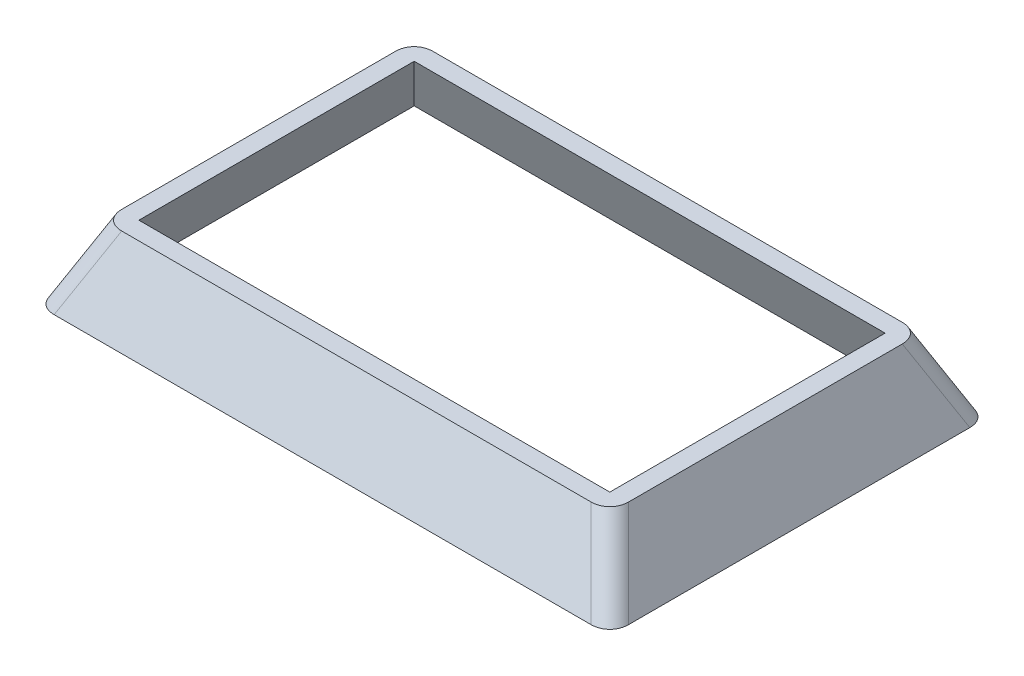
ISO-10303-21;
HEADER;
FILE_DESCRIPTION(('STEP AP214'),'2;1');
FILE_NAME('part.step','',(''),(''),'','','');
FILE_SCHEMA(('AUTOMOTIVE_DESIGN { 1 0 10303 214 1 1 1 1 }'));
ENDSEC;
DATA;
#1=APPLICATION_CONTEXT('core data for automotive mechanical design processes');
#2=APPLICATION_PROTOCOL_DEFINITION('international standard','automotive_design',2000,#1);
#3=PRODUCT_CONTEXT('',#1,'mechanical');
#4=PRODUCT('Part','Part','',(#3));
#5=PRODUCT_RELATED_PRODUCT_CATEGORY('part','',(#4));
#6=PRODUCT_DEFINITION_FORMATION('','',#4);
#7=PRODUCT_DEFINITION_CONTEXT('part definition',#1,'design');
#8=PRODUCT_DEFINITION('design','',#6,#7);
#9=PRODUCT_DEFINITION_SHAPE('','',#8);
#10=(LENGTH_UNIT() NAMED_UNIT(*) SI_UNIT(.MILLI.,.METRE.));
#11=(NAMED_UNIT(*) PLANE_ANGLE_UNIT() SI_UNIT($,.RADIAN.));
#12=(NAMED_UNIT(*) SI_UNIT($,.STERADIAN.) SOLID_ANGLE_UNIT());
#13=UNCERTAINTY_MEASURE_WITH_UNIT(LENGTH_MEASURE(1.E-05),#10,'distance_accuracy_value','');
#14=(GEOMETRIC_REPRESENTATION_CONTEXT(3) GLOBAL_UNCERTAINTY_ASSIGNED_CONTEXT((#13)) GLOBAL_UNIT_ASSIGNED_CONTEXT((#10,
#11,#12)) REPRESENTATION_CONTEXT('',''));
#15=CARTESIAN_POINT('',(0.,0.,0.));
#16=DIRECTION('',(0.,0.,1.));
#17=DIRECTION('',(1.,0.,0.));
#18=AXIS2_PLACEMENT_3D('',#15,#16,#17);
#19=CARTESIAN_POINT('',(0.,7.,0.));
#20=DIRECTION('',(0.,1.,0.));
#21=DIRECTION('',(0.,0.,1.));
#22=AXIS2_PLACEMENT_3D('',#19,#20,#21);
#23=PLANE('',#22);
#24=DIRECTION('',(0.,0.,1.));
#25=VECTOR('',#24,1.);
#26=CARTESIAN_POINT('',(-24.485846392915,7.,18.3));
#27=LINE('',#26,#25);
#28=CARTESIAN_POINT('',(-24.485846392915,7.,-13.2232308188417));
#29=VERTEX_POINT('',#28);
#30=CARTESIAN_POINT('',(-24.485846392915,7.,13.2232308188417));
#31=VERTEX_POINT('',#30);
#32=EDGE_CURVE('E194',#29,#31,#27,.T.);
#33=ORIENTED_EDGE('',*,*,#32,.T.);
#34=CARTESIAN_POINT('',(-22.27909055499,7.,12.82909055499));
#35=DIRECTION('',(0.,1.,0.));
#36=DIRECTION('',(-0.707106781186548,0.,0.707106781186547));
#37=AXIS2_PLACEMENT_3D('',#34,#35,#36);
#38=ELLIPSE('',#37,2.39573426248238,2.);
#39=CARTESIAN_POINT('',(-22.6732308188417,7.,15.035846392915));
#40=VERTEX_POINT('',#39);
#41=EDGE_CURVE('E250',#31,#40,#38,.T.);
#42=ORIENTED_EDGE('',*,*,#41,.T.);
#43=DIRECTION('',(1.,0.,0.));
#44=VECTOR('',#43,1.);
#45=CARTESIAN_POINT('',(27.75,7.,15.035846392915));
#46=LINE('',#45,#44);
#47=CARTESIAN_POINT('',(22.6732308188417,7.,15.035846392915));
#48=VERTEX_POINT('',#47);
#49=EDGE_CURVE('E204',#40,#48,#46,.T.);
#50=ORIENTED_EDGE('',*,*,#49,.T.);
#51=CARTESIAN_POINT('',(22.27909055499,7.,12.82909055499));
#52=DIRECTION('',(0.,1.,0.));
#53=DIRECTION('',(-0.707106781186547,0.,-0.707106781186548));
#54=AXIS2_PLACEMENT_3D('',#51,#52,#53);
#55=ELLIPSE('',#54,2.39573426248238,2.);
#56=CARTESIAN_POINT('',(24.485846392915,7.,13.2232308188417));
#57=VERTEX_POINT('',#56);
#58=EDGE_CURVE('E247',#48,#57,#55,.T.);
#59=ORIENTED_EDGE('',*,*,#58,.T.);
#60=DIRECTION('',(0.,0.,-1.));
#61=VECTOR('',#60,1.);
#62=CARTESIAN_POINT('',(24.485846392915,7.,-18.3));
#63=LINE('',#62,#61);
#64=CARTESIAN_POINT('',(24.485846392915,7.,-13.2232308188417));
#65=VERTEX_POINT('',#64);
#66=EDGE_CURVE('E201',#57,#65,#63,.T.);
#67=ORIENTED_EDGE('',*,*,#66,.T.);
#68=CARTESIAN_POINT('',(22.27909055499,7.,-12.82909055499));
#69=DIRECTION('',(0.,1.,0.));
#70=DIRECTION('',(-0.707106781186547,0.,0.707106781186548));
#71=AXIS2_PLACEMENT_3D('',#68,#69,#70);
#72=ELLIPSE('',#71,2.39573426248238,2.);
#73=CARTESIAN_POINT('',(22.6732308188417,7.,-15.035846392915));
#74=VERTEX_POINT('',#73);
#75=EDGE_CURVE('E67',#65,#74,#72,.T.);
#76=ORIENTED_EDGE('',*,*,#75,.T.);
#77=DIRECTION('',(-1.,0.,0.));
#78=VECTOR('',#77,1.);
#79=CARTESIAN_POINT('',(-27.75,7.,-15.035846392915));
#80=LINE('',#79,#78);
#81=CARTESIAN_POINT('',(-22.6732308188417,7.,-15.035846392915));
#82=VERTEX_POINT('',#81);
#83=EDGE_CURVE('E198',#74,#82,#80,.T.);
#84=ORIENTED_EDGE('',*,*,#83,.T.);
#85=CARTESIAN_POINT('',(-22.27909055499,7.,-12.82909055499));
#86=DIRECTION('',(0.,1.,0.));
#87=DIRECTION('',(-0.707106781186548,0.,-0.707106781186547));
#88=AXIS2_PLACEMENT_3D('',#85,#86,#87);
#89=ELLIPSE('',#88,2.39573426248238,2.);
#90=EDGE_CURVE('E242',#82,#29,#89,.T.);
#91=ORIENTED_EDGE('',*,*,#90,.T.);
#92=EDGE_LOOP('',(#33,#42,#50,#59,#67,#76,#84,#91));
#93=FACE_BOUND('',#92,.T.);
#94=DIRECTION('',(1.,0.,0.));
#95=VECTOR('',#94,1.);
#96=CARTESIAN_POINT('',(-22.75,7.,13.3));
#97=LINE('',#96,#95);
#98=CARTESIAN_POINT('',(-22.75,7.,13.3));
#99=VERTEX_POINT('',#98);
#100=CARTESIAN_POINT('',(22.75,7.,13.3));
#101=VERTEX_POINT('',#100);
#102=EDGE_CURVE('E139',#99,#101,#97,.T.);
#103=ORIENTED_EDGE('',*,*,#102,.F.);
#104=DIRECTION('',(0.,0.,1.));
#105=VECTOR('',#104,1.);
#106=CARTESIAN_POINT('',(-22.75,7.,-13.3));
#107=LINE('',#106,#105);
#108=CARTESIAN_POINT('',(-22.75,7.,-13.3));
#109=VERTEX_POINT('',#108);
#110=EDGE_CURVE('E150',#109,#99,#107,.T.);
#111=ORIENTED_EDGE('',*,*,#110,.F.);
#112=DIRECTION('',(-1.,0.,0.));
#113=VECTOR('',#112,1.);
#114=CARTESIAN_POINT('',(-22.75,7.,-13.3));
#115=LINE('',#114,#113);
#116=CARTESIAN_POINT('',(22.75,7.,-13.3));
#117=VERTEX_POINT('',#116);
#118=EDGE_CURVE('E163',#117,#109,#115,.T.);
#119=ORIENTED_EDGE('',*,*,#118,.F.);
#120=DIRECTION('',(0.,0.,-1.));
#121=VECTOR('',#120,1.);
#122=CARTESIAN_POINT('',(22.75,7.,-13.3));
#123=LINE('',#122,#121);
#124=EDGE_CURVE('E159',#101,#117,#123,.T.);
#125=ORIENTED_EDGE('',*,*,#124,.F.);
#126=EDGE_LOOP('',(#103,#111,#119,#125));
#127=FACE_BOUND('',#126,.T.);
#128=ADVANCED_FACE('F45',(#93,#127),#23,.T.);
#129=CARTESIAN_POINT('',(0.,0.,0.));
#130=DIRECTION('',(0.,1.,0.));
#131=DIRECTION('',(0.,0.,1.));
#132=AXIS2_PLACEMENT_3D('',#129,#130,#131);
#133=PLANE('',#132);
#134=DIRECTION('',(0.,0.,1.));
#135=VECTOR('',#134,1.);
#136=CARTESIAN_POINT('',(-26.014153607085,0.,13.3));
#137=LINE('',#136,#135);
#138=CARTESIAN_POINT('',(-26.014153607085,0.,-16.564153607085));
#139=VERTEX_POINT('',#138);
#140=CARTESIAN_POINT('',(-26.014153607085,0.,16.564153607085));
#141=VERTEX_POINT('',#140);
#142=EDGE_CURVE('E189',#139,#141,#137,.T.);
#143=ORIENTED_EDGE('',*,*,#142,.T.);
#144=DIRECTION('',(1.,0.,0.));
#145=VECTOR('',#144,1.);
#146=CARTESIAN_POINT('',(22.75,0.,16.564153607085));
#147=LINE('',#146,#145);
#148=CARTESIAN_POINT('',(26.014153607085,0.,16.564153607085));
#149=VERTEX_POINT('',#148);
#150=EDGE_CURVE('E142',#141,#149,#147,.T.);
#151=ORIENTED_EDGE('',*,*,#150,.T.);
#152=DIRECTION('',(0.,0.,-1.));
#153=VECTOR('',#152,1.);
#154=CARTESIAN_POINT('',(26.014153607085,0.,-13.3));
#155=LINE('',#154,#153);
#156=CARTESIAN_POINT('',(26.014153607085,0.,-16.564153607085));
#157=VERTEX_POINT('',#156);
#158=EDGE_CURVE('E183',#149,#157,#155,.T.);
#159=ORIENTED_EDGE('',*,*,#158,.T.);
#160=DIRECTION('',(-1.,0.,0.));
#161=VECTOR('',#160,1.);
#162=CARTESIAN_POINT('',(-22.75,0.,-16.564153607085));
#163=LINE('',#162,#161);
#164=EDGE_CURVE('E186',#157,#139,#163,.T.);
#165=ORIENTED_EDGE('',*,*,#164,.T.);
#166=EDGE_LOOP('',(#143,#151,#159,#165));
#167=FACE_BOUND('',#166,.T.);
#168=DIRECTION('',(1.,0.,0.));
#169=VECTOR('',#168,1.);
#170=CARTESIAN_POINT('',(-27.75,0.,18.3));
#171=LINE('',#170,#169);
#172=CARTESIAN_POINT('',(-25.9373844259267,0.,18.3));
#173=VERTEX_POINT('',#172);
#174=CARTESIAN_POINT('',(25.9373844259267,0.,18.3));
#175=VERTEX_POINT('',#174);
#176=EDGE_CURVE('E172',#173,#175,#171,.T.);
#177=ORIENTED_EDGE('',*,*,#176,.F.);
#178=CARTESIAN_POINT('',(-25.543244162075,0.,16.093244162075));
#179=DIRECTION('',(0.,1.,0.));
#180=DIRECTION('',(-0.707106781186548,0.,0.707106781186547));
#181=AXIS2_PLACEMENT_3D('',#178,#179,#180);
#182=ELLIPSE('',#181,2.39573426248238,2.);
#183=CARTESIAN_POINT('',(-27.75,0.,16.4873844259267));
#184=VERTEX_POINT('',#183);
#185=EDGE_CURVE('E232',#173,#184,#182,.F.);
#186=ORIENTED_EDGE('',*,*,#185,.T.);
#187=DIRECTION('',(0.,0.,1.));
#188=VECTOR('',#187,1.);
#189=CARTESIAN_POINT('',(-27.75,0.,-18.3));
#190=LINE('',#189,#188);
#191=CARTESIAN_POINT('',(-27.75,0.,-16.4873844259267));
#192=VERTEX_POINT('',#191);
#193=EDGE_CURVE('E168',#192,#184,#190,.T.);
#194=ORIENTED_EDGE('',*,*,#193,.F.);
#195=CARTESIAN_POINT('',(-25.543244162075,0.,-16.093244162075));
#196=DIRECTION('',(0.,1.,0.));
#197=DIRECTION('',(-0.707106781186548,0.,-0.707106781186547));
#198=AXIS2_PLACEMENT_3D('',#195,#196,#197);
#199=ELLIPSE('',#198,2.39573426248238,2.);
#200=CARTESIAN_POINT('',(-25.9373844259267,0.,-18.3));
#201=VERTEX_POINT('',#200);
#202=EDGE_CURVE('E223',#192,#201,#199,.F.);
#203=ORIENTED_EDGE('',*,*,#202,.T.);
#204=DIRECTION('',(-1.,0.,0.));
#205=VECTOR('',#204,1.);
#206=CARTESIAN_POINT('',(-27.75,0.,-18.3));
#207=LINE('',#206,#205);
#208=CARTESIAN_POINT('',(25.9373844259267,0.,-18.3));
#209=VERTEX_POINT('',#208);
#210=EDGE_CURVE('E180',#209,#201,#207,.T.);
#211=ORIENTED_EDGE('',*,*,#210,.F.);
#212=CARTESIAN_POINT('',(25.543244162075,0.,-16.093244162075));
#213=DIRECTION('',(0.,1.,0.));
#214=DIRECTION('',(-0.707106781186547,0.,0.707106781186548));
#215=AXIS2_PLACEMENT_3D('',#212,#213,#214);
#216=ELLIPSE('',#215,2.39573426248238,2.);
#217=CARTESIAN_POINT('',(27.75,0.,-16.4873844259267));
#218=VERTEX_POINT('',#217);
#219=EDGE_CURVE('E226',#209,#218,#216,.F.);
#220=ORIENTED_EDGE('',*,*,#219,.T.);
#221=DIRECTION('',(0.,0.,-1.));
#222=VECTOR('',#221,1.);
#223=CARTESIAN_POINT('',(27.75,0.,-18.3));
#224=LINE('',#223,#222);
#225=CARTESIAN_POINT('',(27.75,0.,16.4873844259267));
#226=VERTEX_POINT('',#225);
#227=EDGE_CURVE('E176',#226,#218,#224,.T.);
#228=ORIENTED_EDGE('',*,*,#227,.F.);
#229=CARTESIAN_POINT('',(25.543244162075,0.,16.093244162075));
#230=DIRECTION('',(0.,1.,0.));
#231=DIRECTION('',(-0.707106781186547,0.,-0.707106781186548));
#232=AXIS2_PLACEMENT_3D('',#229,#230,#231);
#233=ELLIPSE('',#232,2.39573426248238,2.);
#234=EDGE_CURVE('E229',#226,#175,#233,.F.);
#235=ORIENTED_EDGE('',*,*,#234,.T.);
#236=EDGE_LOOP('',(#177,#186,#194,#203,#211,#220,#228,#235));
#237=FACE_BOUND('',#236,.T.);
#238=ADVANCED_FACE('F270',(#167,#237),#133,.F.);
#239=CARTESIAN_POINT('',(0.,0.,-16.564153607085));
#240=DIRECTION('',(0.,-0.422618261740698,0.906307787036651));
#241=DIRECTION('',(1.,0.,0.));
#242=AXIS2_PLACEMENT_3D('',#239,#240,#241);
#243=PLANE('',#242);
#244=DIRECTION('',(0.389281620635024,-0.834817129478989,-0.389281620635024));
#245=VECTOR('',#244,1.);
#246=CARTESIAN_POINT('',(22.0719640826474,8.45405271711681,-12.6219640826474));
#247=LINE('',#246,#245);
#248=EDGE_CURVE('E146',#117,#157,#247,.T.);
#249=ORIENTED_EDGE('',*,*,#248,.F.);
#250=ORIENTED_EDGE('',*,*,#118,.T.);
#251=DIRECTION('',(-0.389281620635024,-0.834817129478989,-0.389281620635024));
#252=VECTOR('',#251,1.);
#253=CARTESIAN_POINT('',(-23.5040187851994,5.38300149694583,-14.0540187851993));
#254=LINE('',#253,#252);
#255=EDGE_CURVE('E153',#139,#109,#254,.F.);
#256=ORIENTED_EDGE('',*,*,#255,.F.);
#257=ORIENTED_EDGE('',*,*,#164,.F.);
#258=EDGE_LOOP('',(#249,#250,#256,#257));
#259=FACE_BOUND('',#258,.T.);
#260=ADVANCED_FACE('F305',(#259),#243,.T.);
#261=CARTESIAN_POINT('',(-26.014153607085,0.,0.));
#262=DIRECTION('',(0.906307787036651,-0.422618261740698,0.));
#263=DIRECTION('',(0.,0.,-1.));
#264=AXIS2_PLACEMENT_3D('',#261,#262,#263);
#265=PLANE('',#264);
#266=ORIENTED_EDGE('',*,*,#255,.T.);
#267=ORIENTED_EDGE('',*,*,#110,.T.);
#268=DIRECTION('',(-0.389281620635024,-0.834817129478989,0.389281620635024));
#269=VECTOR('',#268,1.);
#270=CARTESIAN_POINT('',(-22.0719640826474,8.45405271711682,12.6219640826474));
#271=LINE('',#270,#269);
#272=EDGE_CURVE('E135',#141,#99,#271,.F.);
#273=ORIENTED_EDGE('',*,*,#272,.F.);
#274=ORIENTED_EDGE('',*,*,#142,.F.);
#275=EDGE_LOOP('',(#266,#267,#273,#274));
#276=FACE_BOUND('',#275,.T.);
#277=ADVANCED_FACE('F151',(#276),#265,.T.);
#278=CARTESIAN_POINT('',(26.014153607085,0.,0.));
#279=DIRECTION('',(-0.906307787036651,-0.422618261740698,0.));
#280=DIRECTION('',(0.,0.,1.));
#281=AXIS2_PLACEMENT_3D('',#278,#279,#280);
#282=PLANE('',#281);
#283=ORIENTED_EDGE('',*,*,#248,.T.);
#284=ORIENTED_EDGE('',*,*,#158,.F.);
#285=DIRECTION('',(-0.389281620635024,0.834817129478989,-0.389281620635024));
#286=VECTOR('',#285,1.);
#287=CARTESIAN_POINT('',(22.0719640826474,8.45405271711681,12.6219640826474));
#288=LINE('',#287,#286);
#289=EDGE_CURVE('E147',#101,#149,#288,.F.);
#290=ORIENTED_EDGE('',*,*,#289,.F.);
#291=ORIENTED_EDGE('',*,*,#124,.T.);
#292=EDGE_LOOP('',(#283,#284,#290,#291));
#293=FACE_BOUND('',#292,.T.);
#294=ADVANCED_FACE('F316',(#293),#282,.T.);
#295=CARTESIAN_POINT('',(0.,0.,16.564153607085));
#296=DIRECTION('',(0.,-0.422618261740698,-0.906307787036651));
#297=DIRECTION('',(-1.,0.,0.));
#298=AXIS2_PLACEMENT_3D('',#295,#296,#297);
#299=PLANE('',#298);
#300=ORIENTED_EDGE('',*,*,#272,.T.);
#301=ORIENTED_EDGE('',*,*,#102,.T.);
#302=ORIENTED_EDGE('',*,*,#289,.T.);
#303=ORIENTED_EDGE('',*,*,#150,.F.);
#304=EDGE_LOOP('',(#300,#301,#302,#303));
#305=FACE_BOUND('',#304,.T.);
#306=ADVANCED_FACE('F137',(#305),#299,.T.);
#307=CARTESIAN_POINT('',(0.,7.,-15.035846392915));
#308=DIRECTION('',(0.,0.422618261740698,-0.906307787036651));
#309=DIRECTION('',(1.,0.,0.));
#310=AXIS2_PLACEMENT_3D('',#307,#308,#309);
#311=PLANE('',#310);
#312=ORIENTED_EDGE('',*,*,#83,.F.);
#313=DIRECTION('',(-0.389281620635023,0.834817129478989,0.389281620635024));
#314=VECTOR('',#313,1.);
#315=CARTESIAN_POINT('',(19.2373253356492,14.368323086923,-11.5999409097226));
#316=LINE('',#315,#314);
#317=EDGE_CURVE('E11',#74,#209,#316,.F.);
#318=ORIENTED_EDGE('',*,*,#317,.T.);
#319=ORIENTED_EDGE('',*,*,#210,.T.);
#320=DIRECTION('',(-0.389281620635024,-0.834817129478989,-0.389281620635024));
#321=VECTOR('',#320,1.);
#322=CARTESIAN_POINT('',(-19.2373253356492,14.368323086923,-11.5999409097225));
#323=LINE('',#322,#321);
#324=EDGE_CURVE('E54',#201,#82,#323,.F.);
#325=ORIENTED_EDGE('',*,*,#324,.T.);
#326=EDGE_LOOP('',(#312,#318,#319,#325));
#327=FACE_BOUND('',#326,.T.);
#328=ADVANCED_FACE('F290',(#327),#311,.T.);
#329=CARTESIAN_POINT('',(-24.485846392915,7.,0.));
#330=DIRECTION('',(-0.906307787036651,0.422618261740698,0.));
#331=DIRECTION('',(0.,0.,-1.));
#332=AXIS2_PLACEMENT_3D('',#329,#330,#331);
#333=PLANE('',#332);
#334=ORIENTED_EDGE('',*,*,#193,.T.);
#335=DIRECTION('',(-0.389281620635024,-0.834817129478989,0.389281620635024));
#336=VECTOR('',#335,1.);
#337=CARTESIAN_POINT('',(-22.4819956122745,11.297271866752,11.2193800382012));
#338=LINE('',#337,#336);
#339=EDGE_CURVE('E239',#184,#31,#338,.F.);
#340=ORIENTED_EDGE('',*,*,#339,.T.);
#341=ORIENTED_EDGE('',*,*,#32,.F.);
#342=DIRECTION('',(-0.389281620635024,-0.834817129478989,-0.389281620635024));
#343=VECTOR('',#342,1.);
#344=CARTESIAN_POINT('',(-22.4819956122745,11.297271866752,-11.2193800382012));
#345=LINE('',#344,#343);
#346=EDGE_CURVE('E235',#29,#192,#345,.T.);
#347=ORIENTED_EDGE('',*,*,#346,.T.);
#348=EDGE_LOOP('',(#334,#340,#341,#347));
#349=FACE_BOUND('',#348,.T.);
#350=ADVANCED_FACE('F286',(#349),#333,.T.);
#351=CARTESIAN_POINT('',(24.485846392915,7.,0.));
#352=DIRECTION('',(0.906307787036651,0.422618261740697,0.));
#353=DIRECTION('',(0.,0.,1.));
#354=AXIS2_PLACEMENT_3D('',#351,#352,#353);
#355=PLANE('',#354);
#356=ORIENTED_EDGE('',*,*,#66,.F.);
#357=DIRECTION('',(-0.389281620635024,0.834817129478989,-0.389281620635024));
#358=VECTOR('',#357,1.);
#359=CARTESIAN_POINT('',(22.4819956122745,11.297271866752,11.2193800382012));
#360=LINE('',#359,#358);
#361=EDGE_CURVE('E257',#57,#226,#360,.F.);
#362=ORIENTED_EDGE('',*,*,#361,.T.);
#363=ORIENTED_EDGE('',*,*,#227,.T.);
#364=DIRECTION('',(-0.389281620635023,0.834817129478989,0.389281620635024));
#365=VECTOR('',#364,1.);
#366=CARTESIAN_POINT('',(22.4819956122745,11.297271866752,-11.2193800382012));
#367=LINE('',#366,#365);
#368=EDGE_CURVE('E253',#218,#65,#367,.T.);
#369=ORIENTED_EDGE('',*,*,#368,.T.);
#370=EDGE_LOOP('',(#356,#362,#363,#369));
#371=FACE_BOUND('',#370,.T.);
#372=ADVANCED_FACE('F264',(#371),#355,.T.);
#373=CARTESIAN_POINT('',(0.,7.,15.035846392915));
#374=DIRECTION('',(0.,0.422618261740698,0.906307787036651));
#375=DIRECTION('',(-1.,0.,0.));
#376=AXIS2_PLACEMENT_3D('',#373,#374,#375);
#377=PLANE('',#376);
#378=ORIENTED_EDGE('',*,*,#49,.F.);
#379=DIRECTION('',(-0.389281620635024,-0.834817129478989,0.389281620635024));
#380=VECTOR('',#379,1.);
#381=CARTESIAN_POINT('',(-19.2373253356492,14.368323086923,11.5999409097226));
#382=LINE('',#381,#380);
#383=EDGE_CURVE('E219',#40,#173,#382,.T.);
#384=ORIENTED_EDGE('',*,*,#383,.T.);
#385=ORIENTED_EDGE('',*,*,#176,.T.);
#386=DIRECTION('',(-0.389281620635024,0.834817129478989,-0.389281620635024));
#387=VECTOR('',#386,1.);
#388=CARTESIAN_POINT('',(19.2373253356492,14.368323086923,11.5999409097226));
#389=LINE('',#388,#387);
#390=EDGE_CURVE('E208',#175,#48,#389,.T.);
#391=ORIENTED_EDGE('',*,*,#390,.T.);
#392=EDGE_LOOP('',(#378,#384,#385,#391));
#393=FACE_BOUND('',#392,.T.);
#394=ADVANCED_FACE('F277',(#393),#377,.T.);
#395=CARTESIAN_POINT('',(-19.2373253356492,13.5230865634416,9.78732533564926));
#396=DIRECTION('',(-0.389281620635024,-0.834817129478989,0.389281620635024));
#397=DIRECTION('',(0.906307787036651,-0.422618261740698,0.));
#398=AXIS2_PLACEMENT_3D('',#395,#396,#397);
#399=CYLINDRICAL_SURFACE('',#398,2.);
#400=ORIENTED_EDGE('',*,*,#41,.F.);
#401=ORIENTED_EDGE('',*,*,#339,.F.);
#402=ORIENTED_EDGE('',*,*,#185,.F.);
#403=ORIENTED_EDGE('',*,*,#383,.F.);
#404=EDGE_LOOP('',(#400,#401,#402,#403));
#405=FACE_BOUND('',#404,.T.);
#406=ADVANCED_FACE('F283',(#405),#399,.T.);
#407=CARTESIAN_POINT('',(19.2373253356492,13.5230865634416,9.78732533564926));
#408=DIRECTION('',(-0.389281620635023,0.834817129478989,-0.389281620635024));
#409=DIRECTION('',(0.,0.422618261740698,0.906307787036651));
#410=AXIS2_PLACEMENT_3D('',#407,#408,#409);
#411=CYLINDRICAL_SURFACE('',#410,2.);
#412=ORIENTED_EDGE('',*,*,#234,.F.);
#413=ORIENTED_EDGE('',*,*,#361,.F.);
#414=ORIENTED_EDGE('',*,*,#58,.F.);
#415=ORIENTED_EDGE('',*,*,#390,.F.);
#416=EDGE_LOOP('',(#412,#413,#414,#415));
#417=FACE_BOUND('',#416,.T.);
#418=ADVANCED_FACE('F274',(#417),#411,.T.);
#419=CARTESIAN_POINT('',(20.6693800382012,10.4520353432706,-11.2193800382012));
#420=DIRECTION('',(-0.389281620635023,0.834817129478989,0.389281620635024));
#421=DIRECTION('',(0.,-0.422618261740698,0.906307787036651));
#422=AXIS2_PLACEMENT_3D('',#419,#420,#421);
#423=CYLINDRICAL_SURFACE('',#422,2.);
#424=ORIENTED_EDGE('',*,*,#219,.F.);
#425=ORIENTED_EDGE('',*,*,#317,.F.);
#426=ORIENTED_EDGE('',*,*,#75,.F.);
#427=ORIENTED_EDGE('',*,*,#368,.F.);
#428=EDGE_LOOP('',(#424,#425,#426,#427));
#429=FACE_BOUND('',#428,.T.);
#430=ADVANCED_FACE('F293',(#429),#423,.T.);
#431=CARTESIAN_POINT('',(-20.6693800382012,10.4520353432706,-11.2193800382012));
#432=DIRECTION('',(-0.389281620635024,-0.834817129478989,-0.389281620635024));
#433=DIRECTION('',(0.90630778703665,-0.422618261740698,0.));
#434=AXIS2_PLACEMENT_3D('',#431,#432,#433);
#435=CYLINDRICAL_SURFACE('',#434,2.);
#436=ORIENTED_EDGE('',*,*,#90,.F.);
#437=ORIENTED_EDGE('',*,*,#324,.F.);
#438=ORIENTED_EDGE('',*,*,#202,.F.);
#439=ORIENTED_EDGE('',*,*,#346,.F.);
#440=EDGE_LOOP('',(#436,#437,#438,#439));
#441=FACE_BOUND('',#440,.T.);
#442=ADVANCED_FACE('F47',(#441),#435,.T.);
#443=CLOSED_SHELL('',(#128,#238,#260,#277,#294,#306,#328,#350,#372,#394,#406,#418,#430,#442));
#444=MANIFOLD_SOLID_BREP('B2',#443);
#445=ADVANCED_BREP_SHAPE_REPRESENTATION('',(#18,#444),#14);
#446=SHAPE_DEFINITION_REPRESENTATION(#9,#445);
ENDSEC;
END-ISO-10303-21;
